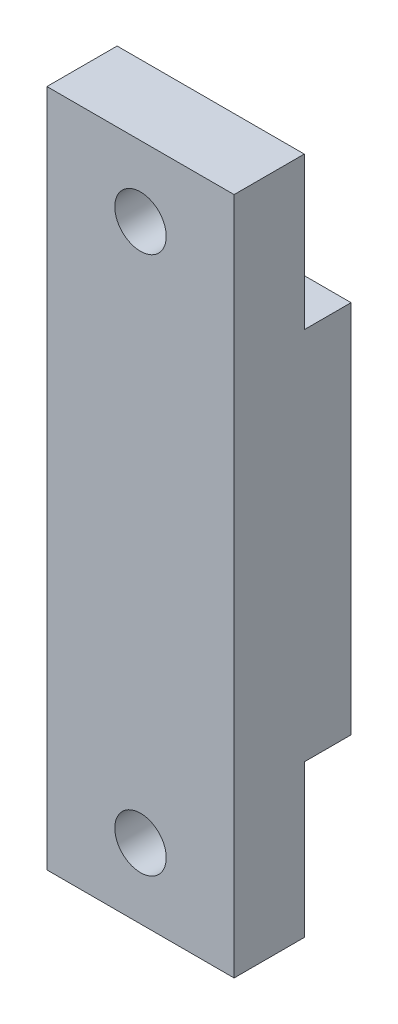
ISO-10303-21;
HEADER;
FILE_DESCRIPTION(('STEP AP214'),'2;1');
FILE_NAME('part.step','',(''),(''),'','','');
FILE_SCHEMA(('AUTOMOTIVE_DESIGN { 1 0 10303 214 1 1 1 1 }'));
ENDSEC;
DATA;
#1=APPLICATION_CONTEXT('core data for automotive mechanical design processes');
#2=APPLICATION_PROTOCOL_DEFINITION('international standard','automotive_design',2000,#1);
#3=PRODUCT_CONTEXT('',#1,'mechanical');
#4=PRODUCT('Part','Part','',(#3));
#5=PRODUCT_RELATED_PRODUCT_CATEGORY('part','',(#4));
#6=PRODUCT_DEFINITION_FORMATION('','',#4);
#7=PRODUCT_DEFINITION_CONTEXT('part definition',#1,'design');
#8=PRODUCT_DEFINITION('design','',#6,#7);
#9=PRODUCT_DEFINITION_SHAPE('','',#8);
#10=(LENGTH_UNIT() NAMED_UNIT(*) SI_UNIT(.MILLI.,.METRE.));
#11=(NAMED_UNIT(*) PLANE_ANGLE_UNIT() SI_UNIT($,.RADIAN.));
#12=(NAMED_UNIT(*) SI_UNIT($,.STERADIAN.) SOLID_ANGLE_UNIT());
#13=UNCERTAINTY_MEASURE_WITH_UNIT(LENGTH_MEASURE(1.E-05),#10,'distance_accuracy_value','');
#14=(GEOMETRIC_REPRESENTATION_CONTEXT(3) GLOBAL_UNCERTAINTY_ASSIGNED_CONTEXT((#13)) GLOBAL_UNIT_ASSIGNED_CONTEXT((#10,
#11,#12)) REPRESENTATION_CONTEXT('',''));
#15=CARTESIAN_POINT('',(0.,0.,0.));
#16=DIRECTION('',(0.,0.,1.));
#17=DIRECTION('',(1.,0.,0.));
#18=AXIS2_PLACEMENT_3D('',#15,#16,#17);
#19=CARTESIAN_POINT('',(0.,0.,0.));
#20=DIRECTION('',(0.,0.,1.));
#21=DIRECTION('',(1.,0.,0.));
#22=AXIS2_PLACEMENT_3D('',#19,#20,#21);
#23=PLANE('',#22);
#24=CARTESIAN_POINT('',(0.,-11.5,0.));
#25=DIRECTION('',(0.,0.,1.));
#26=DIRECTION('',(1.,0.,0.));
#27=AXIS2_PLACEMENT_3D('',#24,#25,#26);
#28=CIRCLE('',#27,1.1);
#29=CARTESIAN_POINT('',(1.1,-11.5,0.));
#30=VERTEX_POINT('',#29);
#31=EDGE_CURVE('E135',#30,#30,#28,.F.);
#32=ORIENTED_EDGE('',*,*,#31,.F.);
#33=EDGE_LOOP('',(#32));
#34=FACE_BOUND('',#33,.T.);
#35=DIRECTION('',(0.,-1.,0.));
#36=VECTOR('',#35,1.);
#37=CARTESIAN_POINT('',(-4.,14.5,0.));
#38=LINE('',#37,#36);
#39=CARTESIAN_POINT('',(-4.,-8.,0.));
#40=VERTEX_POINT('',#39);
#41=CARTESIAN_POINT('',(-4.,-14.5,0.));
#42=VERTEX_POINT('',#41);
#43=EDGE_CURVE('E159',#40,#42,#38,.T.);
#44=ORIENTED_EDGE('',*,*,#43,.F.);
#45=DIRECTION('',(1.,0.,0.));
#46=VECTOR('',#45,1.);
#47=CARTESIAN_POINT('',(4.,-8.,0.));
#48=LINE('',#47,#46);
#49=CARTESIAN_POINT('',(4.,-8.,0.));
#50=VERTEX_POINT('',#49);
#51=EDGE_CURVE('E113',#40,#50,#48,.T.);
#52=ORIENTED_EDGE('',*,*,#51,.T.);
#53=DIRECTION('',(0.,1.,0.));
#54=VECTOR('',#53,1.);
#55=CARTESIAN_POINT('',(4.,14.5,0.));
#56=LINE('',#55,#54);
#57=CARTESIAN_POINT('',(4.,-14.5,0.));
#58=VERTEX_POINT('',#57);
#59=EDGE_CURVE('E154',#58,#50,#56,.T.);
#60=ORIENTED_EDGE('',*,*,#59,.F.);
#61=DIRECTION('',(1.,0.,0.));
#62=VECTOR('',#61,1.);
#63=CARTESIAN_POINT('',(-4.,-14.5,0.));
#64=LINE('',#63,#62);
#65=EDGE_CURVE('E78',#42,#58,#64,.T.);
#66=ORIENTED_EDGE('',*,*,#65,.F.);
#67=EDGE_LOOP('',(#44,#52,#60,#66));
#68=FACE_BOUND('',#67,.T.);
#69=ADVANCED_FACE('F33',(#34,#68),#23,.F.);
#70=CARTESIAN_POINT('',(4.,14.5,3.));
#71=DIRECTION('',(-1.,0.,0.));
#72=DIRECTION('',(0.,-1.,0.));
#73=AXIS2_PLACEMENT_3D('',#70,#71,#72);
#74=PLANE('',#73);
#75=ORIENTED_EDGE('',*,*,#59,.T.);
#76=DIRECTION('',(0.,0.,1.));
#77=VECTOR('',#76,1.);
#78=CARTESIAN_POINT('',(4.,-8.,-2.));
#79=LINE('',#78,#77);
#80=CARTESIAN_POINT('',(4.,-8.,-2.));
#81=VERTEX_POINT('',#80);
#82=EDGE_CURVE('E117',#81,#50,#79,.T.);
#83=ORIENTED_EDGE('',*,*,#82,.F.);
#84=DIRECTION('',(0.,1.,0.));
#85=VECTOR('',#84,1.);
#86=CARTESIAN_POINT('',(4.,8.,-2.));
#87=LINE('',#86,#85);
#88=CARTESIAN_POINT('',(4.,8.,-2.));
#89=VERTEX_POINT('',#88);
#90=EDGE_CURVE('E127',#81,#89,#87,.T.);
#91=ORIENTED_EDGE('',*,*,#90,.T.);
#92=DIRECTION('',(0.,0.,1.));
#93=VECTOR('',#92,1.);
#94=CARTESIAN_POINT('',(4.,8.,-2.));
#95=LINE('',#94,#93);
#96=CARTESIAN_POINT('',(4.,8.,0.));
#97=VERTEX_POINT('',#96);
#98=EDGE_CURVE('E144',#89,#97,#95,.T.);
#99=ORIENTED_EDGE('',*,*,#98,.T.);
#100=CARTESIAN_POINT('',(4.,14.5,0.));
#101=VERTEX_POINT('',#100);
#102=EDGE_CURVE('E143',#97,#101,#56,.T.);
#103=ORIENTED_EDGE('',*,*,#102,.T.);
#104=DIRECTION('',(0.,0.,-1.));
#105=VECTOR('',#104,1.);
#106=CARTESIAN_POINT('',(4.,14.5,3.));
#107=LINE('',#106,#105);
#108=CARTESIAN_POINT('',(4.,14.5,3.));
#109=VERTEX_POINT('',#108);
#110=EDGE_CURVE('E11',#109,#101,#107,.T.);
#111=ORIENTED_EDGE('',*,*,#110,.F.);
#112=DIRECTION('',(0.,1.,0.));
#113=VECTOR('',#112,1.);
#114=CARTESIAN_POINT('',(4.,14.5,3.));
#115=LINE('',#114,#113);
#116=CARTESIAN_POINT('',(4.,-14.5,3.));
#117=VERTEX_POINT('',#116);
#118=EDGE_CURVE('E147',#117,#109,#115,.T.);
#119=ORIENTED_EDGE('',*,*,#118,.F.);
#120=DIRECTION('',(0.,0.,-1.));
#121=VECTOR('',#120,1.);
#122=CARTESIAN_POINT('',(4.,-14.5,3.));
#123=LINE('',#122,#121);
#124=EDGE_CURVE('E153',#117,#58,#123,.T.);
#125=ORIENTED_EDGE('',*,*,#124,.T.);
#126=EDGE_LOOP('',(#75,#83,#91,#99,#103,#111,#119,#125));
#127=FACE_BOUND('',#126,.T.);
#128=ADVANCED_FACE('F35',(#127),#74,.F.);
#129=CARTESIAN_POINT('',(-4.,14.5,3.));
#130=DIRECTION('',(0.,-1.,0.));
#131=DIRECTION('',(0.,0.,-1.));
#132=AXIS2_PLACEMENT_3D('',#129,#130,#131);
#133=PLANE('',#132);
#134=DIRECTION('',(-1.,0.,0.));
#135=VECTOR('',#134,1.);
#136=CARTESIAN_POINT('',(-4.,14.5,0.));
#137=LINE('',#136,#135);
#138=CARTESIAN_POINT('',(-4.,14.5,0.));
#139=VERTEX_POINT('',#138);
#140=EDGE_CURVE('E157',#101,#139,#137,.T.);
#141=ORIENTED_EDGE('',*,*,#140,.T.);
#142=DIRECTION('',(0.,0.,-1.));
#143=VECTOR('',#142,1.);
#144=CARTESIAN_POINT('',(-4.,14.5,3.));
#145=LINE('',#144,#143);
#146=CARTESIAN_POINT('',(-4.,14.5,3.));
#147=VERTEX_POINT('',#146);
#148=EDGE_CURVE('E41',#147,#139,#145,.T.);
#149=ORIENTED_EDGE('',*,*,#148,.F.);
#150=DIRECTION('',(-1.,0.,0.));
#151=VECTOR('',#150,1.);
#152=CARTESIAN_POINT('',(-4.,14.5,3.));
#153=LINE('',#152,#151);
#154=EDGE_CURVE('E85',#109,#147,#153,.T.);
#155=ORIENTED_EDGE('',*,*,#154,.F.);
#156=ORIENTED_EDGE('',*,*,#110,.T.);
#157=EDGE_LOOP('',(#141,#149,#155,#156));
#158=FACE_BOUND('',#157,.T.);
#159=ADVANCED_FACE('F199',(#158),#133,.F.);
#160=CARTESIAN_POINT('',(-4.,14.5,3.));
#161=DIRECTION('',(1.,0.,0.));
#162=DIRECTION('',(0.,1.,0.));
#163=AXIS2_PLACEMENT_3D('',#160,#161,#162);
#164=PLANE('',#163);
#165=CARTESIAN_POINT('',(-4.,8.,0.));
#166=VERTEX_POINT('',#165);
#167=EDGE_CURVE('E160',#139,#166,#38,.T.);
#168=ORIENTED_EDGE('',*,*,#167,.T.);
#169=DIRECTION('',(0.,0.,1.));
#170=VECTOR('',#169,1.);
#171=CARTESIAN_POINT('',(-4.,8.,-2.));
#172=LINE('',#171,#170);
#173=CARTESIAN_POINT('',(-4.,8.,-2.));
#174=VERTEX_POINT('',#173);
#175=EDGE_CURVE('E48',#174,#166,#172,.T.);
#176=ORIENTED_EDGE('',*,*,#175,.F.);
#177=DIRECTION('',(0.,-1.,0.));
#178=VECTOR('',#177,1.);
#179=CARTESIAN_POINT('',(-4.,8.,-2.));
#180=LINE('',#179,#178);
#181=CARTESIAN_POINT('',(-4.,-8.,-2.));
#182=VERTEX_POINT('',#181);
#183=EDGE_CURVE('E125',#174,#182,#180,.T.);
#184=ORIENTED_EDGE('',*,*,#183,.T.);
#185=DIRECTION('',(0.,0.,1.));
#186=VECTOR('',#185,1.);
#187=CARTESIAN_POINT('',(-4.,-8.,-2.));
#188=LINE('',#187,#186);
#189=EDGE_CURVE('E108',#182,#40,#188,.T.);
#190=ORIENTED_EDGE('',*,*,#189,.T.);
#191=ORIENTED_EDGE('',*,*,#43,.T.);
#192=DIRECTION('',(0.,0.,-1.));
#193=VECTOR('',#192,1.);
#194=CARTESIAN_POINT('',(-4.,-14.5,3.));
#195=LINE('',#194,#193);
#196=CARTESIAN_POINT('',(-4.,-14.5,3.));
#197=VERTEX_POINT('',#196);
#198=EDGE_CURVE('E164',#197,#42,#195,.T.);
#199=ORIENTED_EDGE('',*,*,#198,.F.);
#200=DIRECTION('',(0.,-1.,0.));
#201=VECTOR('',#200,1.);
#202=CARTESIAN_POINT('',(-4.,14.5,3.));
#203=LINE('',#202,#201);
#204=EDGE_CURVE('E150',#147,#197,#203,.T.);
#205=ORIENTED_EDGE('',*,*,#204,.F.);
#206=ORIENTED_EDGE('',*,*,#148,.T.);
#207=EDGE_LOOP('',(#168,#176,#184,#190,#191,#199,#205,#206));
#208=FACE_BOUND('',#207,.T.);
#209=ADVANCED_FACE('F130',(#208),#164,.F.);
#210=CARTESIAN_POINT('',(-4.,-14.5,3.));
#211=DIRECTION('',(0.,1.,0.));
#212=DIRECTION('',(0.,0.,1.));
#213=AXIS2_PLACEMENT_3D('',#210,#211,#212);
#214=PLANE('',#213);
#215=ORIENTED_EDGE('',*,*,#65,.T.);
#216=ORIENTED_EDGE('',*,*,#124,.F.);
#217=DIRECTION('',(1.,0.,0.));
#218=VECTOR('',#217,1.);
#219=CARTESIAN_POINT('',(-4.,-14.5,3.));
#220=LINE('',#219,#218);
#221=EDGE_CURVE('E57',#197,#117,#220,.T.);
#222=ORIENTED_EDGE('',*,*,#221,.F.);
#223=ORIENTED_EDGE('',*,*,#198,.T.);
#224=EDGE_LOOP('',(#215,#216,#222,#223));
#225=FACE_BOUND('',#224,.T.);
#226=ADVANCED_FACE('F177',(#225),#214,.F.);
#227=CARTESIAN_POINT('',(0.,0.,3.));
#228=DIRECTION('',(0.,0.,1.));
#229=DIRECTION('',(1.,0.,0.));
#230=AXIS2_PLACEMENT_3D('',#227,#228,#229);
#231=PLANE('',#230);
#232=CARTESIAN_POINT('',(0.,11.5,3.));
#233=DIRECTION('',(0.,0.,1.));
#234=DIRECTION('',(1.,0.,0.));
#235=AXIS2_PLACEMENT_3D('',#232,#233,#234);
#236=CIRCLE('',#235,1.1);
#237=CARTESIAN_POINT('',(1.1,11.5,3.));
#238=VERTEX_POINT('',#237);
#239=EDGE_CURVE('E294',#238,#238,#236,.T.);
#240=ORIENTED_EDGE('',*,*,#239,.F.);
#241=EDGE_LOOP('',(#240));
#242=FACE_BOUND('',#241,.T.);
#243=CARTESIAN_POINT('',(0.,-11.5,3.));
#244=DIRECTION('',(0.,0.,1.));
#245=DIRECTION('',(-1.,0.,0.));
#246=AXIS2_PLACEMENT_3D('',#243,#244,#245);
#247=CIRCLE('',#246,1.1);
#248=CARTESIAN_POINT('',(-1.1,-11.5,3.));
#249=VERTEX_POINT('',#248);
#250=EDGE_CURVE('E292',#249,#249,#247,.T.);
#251=ORIENTED_EDGE('',*,*,#250,.F.);
#252=EDGE_LOOP('',(#251));
#253=FACE_BOUND('',#252,.T.);
#254=ORIENTED_EDGE('',*,*,#118,.T.);
#255=ORIENTED_EDGE('',*,*,#154,.T.);
#256=ORIENTED_EDGE('',*,*,#204,.T.);
#257=ORIENTED_EDGE('',*,*,#221,.T.);
#258=EDGE_LOOP('',(#254,#255,#256,#257));
#259=FACE_BOUND('',#258,.T.);
#260=ADVANCED_FACE('F180',(#242,#253,#259),#231,.T.);
#261=CARTESIAN_POINT('',(0.,11.5,0.));
#262=DIRECTION('',(0.,0.,1.));
#263=DIRECTION('',(1.,0.,0.));
#264=AXIS2_PLACEMENT_3D('',#261,#262,#263);
#265=CIRCLE('',#264,1.1);
#266=CARTESIAN_POINT('',(1.1,11.5,0.));
#267=VERTEX_POINT('',#266);
#268=EDGE_CURVE('E140',#267,#267,#265,.F.);
#269=ORIENTED_EDGE('',*,*,#268,.F.);
#270=EDGE_LOOP('',(#269));
#271=FACE_BOUND('',#270,.T.);
#272=ORIENTED_EDGE('',*,*,#102,.F.);
#273=DIRECTION('',(-1.,0.,0.));
#274=VECTOR('',#273,1.);
#275=CARTESIAN_POINT('',(4.,8.,0.));
#276=LINE('',#275,#274);
#277=EDGE_CURVE('E131',#97,#166,#276,.T.);
#278=ORIENTED_EDGE('',*,*,#277,.T.);
#279=ORIENTED_EDGE('',*,*,#167,.F.);
#280=ORIENTED_EDGE('',*,*,#140,.F.);
#281=EDGE_LOOP('',(#272,#278,#279,#280));
#282=FACE_BOUND('',#281,.T.);
#283=ADVANCED_FACE('F172',(#271,#282),#23,.F.);
#284=CARTESIAN_POINT('',(4.,8.,-2.));
#285=DIRECTION('',(0.,1.,0.));
#286=DIRECTION('',(0.,0.,1.));
#287=AXIS2_PLACEMENT_3D('',#284,#285,#286);
#288=PLANE('',#287);
#289=ORIENTED_EDGE('',*,*,#277,.F.);
#290=ORIENTED_EDGE('',*,*,#98,.F.);
#291=DIRECTION('',(-1.,0.,0.));
#292=VECTOR('',#291,1.);
#293=CARTESIAN_POINT('',(4.,8.,-2.));
#294=LINE('',#293,#292);
#295=EDGE_CURVE('E118',#89,#174,#294,.T.);
#296=ORIENTED_EDGE('',*,*,#295,.T.);
#297=ORIENTED_EDGE('',*,*,#175,.T.);
#298=EDGE_LOOP('',(#289,#290,#296,#297));
#299=FACE_BOUND('',#298,.T.);
#300=ADVANCED_FACE('F173',(#299),#288,.T.);
#301=CARTESIAN_POINT('',(4.,-8.,-2.));
#302=DIRECTION('',(0.,-1.,0.));
#303=DIRECTION('',(0.,0.,-1.));
#304=AXIS2_PLACEMENT_3D('',#301,#302,#303);
#305=PLANE('',#304);
#306=ORIENTED_EDGE('',*,*,#51,.F.);
#307=ORIENTED_EDGE('',*,*,#189,.F.);
#308=DIRECTION('',(1.,0.,0.));
#309=VECTOR('',#308,1.);
#310=CARTESIAN_POINT('',(4.,-8.,-2.));
#311=LINE('',#310,#309);
#312=EDGE_CURVE('E111',#182,#81,#311,.T.);
#313=ORIENTED_EDGE('',*,*,#312,.T.);
#314=ORIENTED_EDGE('',*,*,#82,.T.);
#315=EDGE_LOOP('',(#306,#307,#313,#314));
#316=FACE_BOUND('',#315,.T.);
#317=ADVANCED_FACE('F110',(#316),#305,.T.);
#318=CARTESIAN_POINT('',(0.,0.,-2.));
#319=DIRECTION('',(0.,0.,-1.));
#320=DIRECTION('',(-1.,0.,0.));
#321=AXIS2_PLACEMENT_3D('',#318,#319,#320);
#322=PLANE('',#321);
#323=ORIENTED_EDGE('',*,*,#183,.F.);
#324=ORIENTED_EDGE('',*,*,#295,.F.);
#325=ORIENTED_EDGE('',*,*,#90,.F.);
#326=ORIENTED_EDGE('',*,*,#312,.F.);
#327=EDGE_LOOP('',(#323,#324,#325,#326));
#328=FACE_BOUND('',#327,.T.);
#329=ADVANCED_FACE('F123',(#328),#322,.T.);
#330=CARTESIAN_POINT('',(0.,11.5,-2.001));
#331=DIRECTION('',(0.,0.,1.));
#332=DIRECTION('',(1.,0.,0.));
#333=AXIS2_PLACEMENT_3D('',#330,#331,#332);
#334=CYLINDRICAL_SURFACE('',#333,1.1);
#335=ORIENTED_EDGE('',*,*,#239,.T.);
#336=EDGE_LOOP('',(#335));
#337=FACE_BOUND('',#336,.T.);
#338=ORIENTED_EDGE('',*,*,#268,.T.);
#339=EDGE_LOOP('',(#338));
#340=FACE_BOUND('',#339,.T.);
#341=ADVANCED_FACE('F256',(#337,#340),#334,.F.);
#342=CARTESIAN_POINT('',(0.,-11.5,-2.001));
#343=DIRECTION('',(0.,0.,1.));
#344=DIRECTION('',(1.,0.,0.));
#345=AXIS2_PLACEMENT_3D('',#342,#343,#344);
#346=CYLINDRICAL_SURFACE('',#345,1.1);
#347=ORIENTED_EDGE('',*,*,#250,.T.);
#348=EDGE_LOOP('',(#347));
#349=FACE_BOUND('',#348,.T.);
#350=ORIENTED_EDGE('',*,*,#31,.T.);
#351=EDGE_LOOP('',(#350));
#352=FACE_BOUND('',#351,.T.);
#353=ADVANCED_FACE('F264',(#349,#352),#346,.F.);
#354=CLOSED_SHELL('',(#69,#128,#159,#209,#226,#260,#283,#300,#317,#329,#341,#353));
#355=MANIFOLD_SOLID_BREP('B2',#354);
#356=ADVANCED_BREP_SHAPE_REPRESENTATION('',(#18,#355),#14);
#357=SHAPE_DEFINITION_REPRESENTATION(#9,#356);
ENDSEC;
END-ISO-10303-21;
